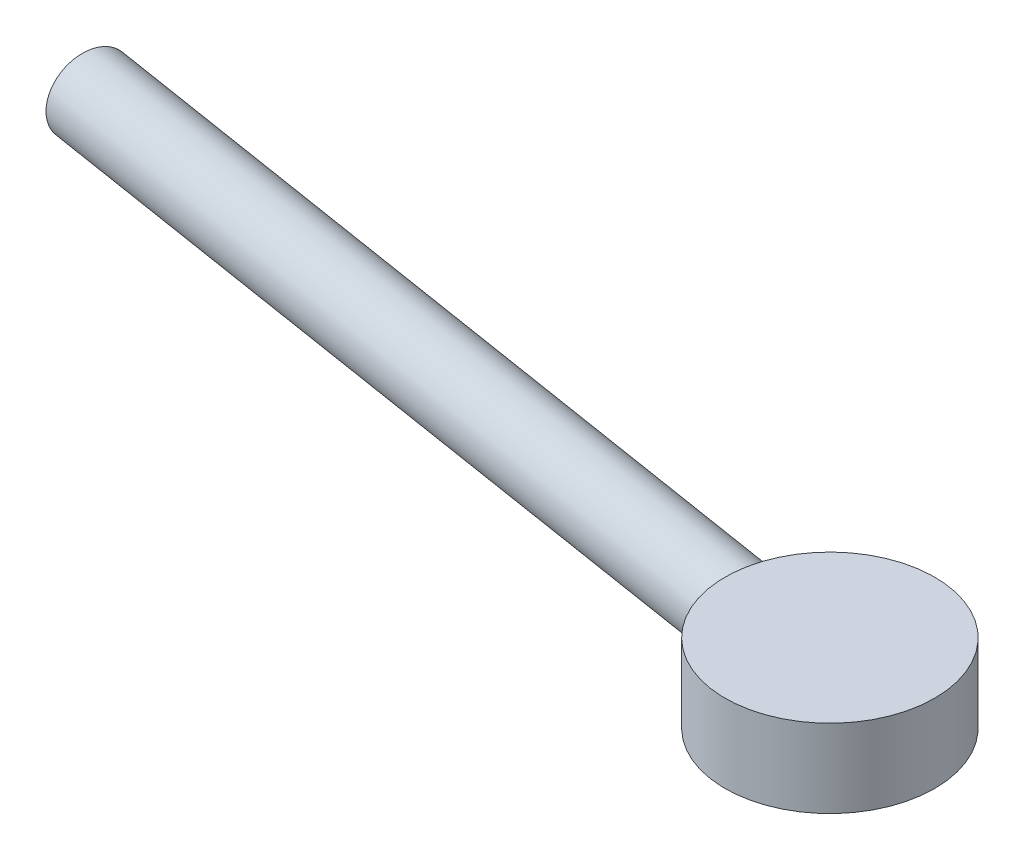
ISO-10303-21;
HEADER;
FILE_DESCRIPTION(('STEP AP214'),'2;1');
FILE_NAME('part.step','',(''),(''),'','','');
FILE_SCHEMA(('AUTOMOTIVE_DESIGN { 1 0 10303 214 1 1 1 1 }'));
ENDSEC;
DATA;
#1=APPLICATION_CONTEXT('core data for automotive mechanical design processes');
#2=APPLICATION_PROTOCOL_DEFINITION('international standard','automotive_design',2000,#1);
#3=PRODUCT_CONTEXT('',#1,'mechanical');
#4=PRODUCT('Part','Part','',(#3));
#5=PRODUCT_RELATED_PRODUCT_CATEGORY('part','',(#4));
#6=PRODUCT_DEFINITION_FORMATION('','',#4);
#7=PRODUCT_DEFINITION_CONTEXT('part definition',#1,'design');
#8=PRODUCT_DEFINITION('design','',#6,#7);
#9=PRODUCT_DEFINITION_SHAPE('','',#8);
#10=(LENGTH_UNIT() NAMED_UNIT(*) SI_UNIT(.MILLI.,.METRE.));
#11=(NAMED_UNIT(*) PLANE_ANGLE_UNIT() SI_UNIT($,.RADIAN.));
#12=(NAMED_UNIT(*) SI_UNIT($,.STERADIAN.) SOLID_ANGLE_UNIT());
#13=UNCERTAINTY_MEASURE_WITH_UNIT(LENGTH_MEASURE(1.E-05),#10,'distance_accuracy_value','');
#14=(GEOMETRIC_REPRESENTATION_CONTEXT(3) GLOBAL_UNCERTAINTY_ASSIGNED_CONTEXT((#13)) GLOBAL_UNIT_ASSIGNED_CONTEXT((#10,
#11,#12)) REPRESENTATION_CONTEXT('',''));
#15=CARTESIAN_POINT('',(0.,0.,0.));
#16=DIRECTION('',(0.,0.,1.));
#17=DIRECTION('',(1.,0.,0.));
#18=AXIS2_PLACEMENT_3D('',#15,#16,#17);
#19=CARTESIAN_POINT('',(271.72363231668,-177.5,758.099174894368));
#20=DIRECTION('',(0.,-1.,0.));
#21=DIRECTION('',(1.,0.,0.));
#22=AXIS2_PLACEMENT_3D('',#19,#20,#21);
#23=CYLINDRICAL_SURFACE('',#22,100.5);
#24=CARTESIAN_POINT('',(172.46982427228,-179.,742.321608900678));
#25=CARTESIAN_POINT('',(172.31631210881,-178.999997315081,743.287313929384));
#26=CARTESIAN_POINT('',(172.176934915852,-179.039870688081,744.255226601131));
#27=CARTESIAN_POINT('',(171.927194829372,-179.19895285225,746.188229031664));
#28=CARTESIAN_POINT('',(171.816830409184,-179.318157467804,747.153318936342));
#29=CARTESIAN_POINT('',(171.625096877349,-179.634717946961,749.073425182902));
#30=CARTESIAN_POINT('',(171.543726083843,-179.832069276039,750.028442105977));
#31=CARTESIAN_POINT('',(171.409192871476,-180.303058640155,751.921491941369));
#32=CARTESIAN_POINT('',(171.356030968829,-180.576698071108,752.859524542573));
#33=CARTESIAN_POINT('',(171.276525609291,-181.197231677718,754.710208248718));
#34=CARTESIAN_POINT('',(171.250132037521,-181.543987490745,755.622903660312));
#35=CARTESIAN_POINT('',(171.221925028493,-182.308176089655,757.41855790376));
#36=CARTESIAN_POINT('',(171.220111451549,-182.725608473871,758.301516904577));
#37=CARTESIAN_POINT('',(171.238495685095,-183.628046415343,760.03214508369));
#38=CARTESIAN_POINT('',(171.258697556974,-184.113064426327,760.879807720594));
#39=CARTESIAN_POINT('',(171.318130990364,-185.147184500078,762.534351560117));
#40=CARTESIAN_POINT('',(171.357363094487,-185.696288389794,763.341231599173));
#41=CARTESIAN_POINT('',(171.453230711861,-186.875658069705,764.937146397411));
#42=CARTESIAN_POINT('',(171.510433158378,-187.508108924389,765.724538198363));
#43=CARTESIAN_POINT('',(171.605903087485,-188.502223324553,766.864789395588));
#44=CARTESIAN_POINT('',(171.639339491561,-188.841187196011,767.23808595662));
#45=CARTESIAN_POINT('',(171.708934236078,-189.533887574503,767.970625178138));
#46=CARTESIAN_POINT('',(171.745093233737,-189.88762763919,768.329864413256));
#47=CARTESIAN_POINT('',(171.856872679971,-190.970173200054,769.385493183875));
#48=CARTESIAN_POINT('',(171.935799934545,-191.720348100585,770.059844302957));
#49=CARTESIAN_POINT('',(172.098209226895,-193.2730467989,771.344725792829));
#50=CARTESIAN_POINT('',(172.181691247272,-194.075570396697,771.955256407408));
#51=CARTESIAN_POINT('',(172.308561442199,-195.329138139195,772.829565525753));
#52=CARTESIAN_POINT('',(172.351851038787,-195.762847446274,773.118464323782));
#53=CARTESIAN_POINT('',(172.437922496907,-196.642215466614,773.677291087028));
#54=CARTESIAN_POINT('',(172.480704477207,-197.087871301861,773.947223565638));
#55=CARTESIAN_POINT('',(172.607454754822,-198.441976920719,774.727810462698));
#56=CARTESIAN_POINT('',(172.689834679751,-199.36763521868,775.209303489732));
#57=CARTESIAN_POINT('',(172.8459174594,-201.257839194196,776.089377097382));
#58=CARTESIAN_POINT('',(172.91962274925,-202.222373855879,776.487980970725));
#59=CARTESIAN_POINT('',(173.054459618276,-204.183833817146,777.198264008991));
#60=CARTESIAN_POINT('',(173.115591862501,-205.180757400296,777.509947771837));
#61=CARTESIAN_POINT('',(173.219942663182,-207.160932721956,778.032600535462));
#62=CARTESIAN_POINT('',(173.263754318327,-208.143261371265,778.246950419994));
#63=CARTESIAN_POINT('',(173.334440781677,-210.123465426699,778.589359749567));
#64=CARTESIAN_POINT('',(173.361315990622,-211.121340464402,778.717421236312));
#65=CARTESIAN_POINT('',(173.396731768693,-213.124483183985,778.885662164082));
#66=CARTESIAN_POINT('',(173.405278154783,-214.129748418797,778.925869487199));
#67=CARTESIAN_POINT('',(173.40360639912,-216.139898533814,778.917978016083));
#68=CARTESIAN_POINT('',(173.39338889884,-217.144783425845,778.869882240629));
#69=CARTESIAN_POINT('',(173.355772666558,-219.092106097862,778.690966260714));
#70=CARTESIAN_POINT('',(173.329330160243,-220.03498918714,778.564746907144));
#71=CARTESIAN_POINT('',(173.261364944105,-221.906582664612,778.235216560234));
#72=CARTESIAN_POINT('',(173.219842857373,-222.83529363675,778.03190875219));
#73=CARTESIAN_POINT('',(173.1236096973,-224.672427838032,777.55028625293));
#74=CARTESIAN_POINT('',(173.068897361894,-225.580849116733,777.271964383951));
#75=CARTESIAN_POINT('',(172.948750184362,-227.371546827156,776.643043486596));
#76=CARTESIAN_POINT('',(172.883315019035,-228.253822469866,776.292442279544));
#77=CARTESIAN_POINT('',(172.743375869885,-230.002496861909,775.515185063674));
#78=CARTESIAN_POINT('',(172.668731317377,-230.868334330543,775.087287531661));
#79=CARTESIAN_POINT('',(172.553252981936,-232.1387008791,774.394590182268));
#80=CARTESIAN_POINT('',(172.514172969596,-232.55744442844,774.155203032689));
#81=CARTESIAN_POINT('',(172.435274714456,-233.385070552599,773.659861739948));
#82=CARTESIAN_POINT('',(172.395456315818,-233.793951002895,773.403904070455));
#83=CARTESIAN_POINT('',(172.27557698255,-235.004888816677,772.611909833381));
#84=CARTESIAN_POINT('',(172.195088578829,-235.791278552082,772.051732429964));
#85=CARTESIAN_POINT('',(172.036714799602,-237.317752510704,770.871137878967));
#86=CARTESIAN_POINT('',(171.958829531222,-238.057834829343,770.250718256359));
#87=CARTESIAN_POINT('',(171.844486899156,-239.15200414056,769.258309660181));
#88=CARTESIAN_POINT('',(171.805742750429,-239.524224746425,768.906392708918));
#89=CARTESIAN_POINT('',(171.730599110932,-240.253876526776,768.187481874371));
#90=CARTESIAN_POINT('',(171.694199082307,-240.611311087118,767.820491481546));
#91=CARTESIAN_POINT('',(171.58931568877,-241.660811838135,766.697633395866));
#92=CARTESIAN_POINT('',(171.525144194334,-242.330120128007,765.919837927903));
#93=CARTESIAN_POINT('',(171.412572562628,-243.603387242922,764.311373665897));
#94=CARTESIAN_POINT('',(171.364174593008,-244.207337078573,763.48069762356));
#95=CARTESIAN_POINT('',(171.287129901791,-245.345702094789,761.772065014048));
#96=CARTESIAN_POINT('',(171.258483046338,-245.880117746573,760.894108767338));
#97=CARTESIAN_POINT('',(171.224345735117,-246.881861070195,759.085200838111));
#98=CARTESIAN_POINT('',(171.21916299948,-247.348220026073,758.153706265412));
#99=CARTESIAN_POINT('',(171.236067498901,-248.201445158735,756.255170337718));
#100=CARTESIAN_POINT('',(171.258155168355,-248.588310069126,755.28812841672));
#101=CARTESIAN_POINT('',(171.332238126327,-249.278832139014,753.326209490785));
#102=CARTESIAN_POINT('',(171.384223619152,-249.582516503611,752.331341704206));
#103=CARTESIAN_POINT('',(171.519985226683,-250.103786146196,750.321426685611));
#104=CARTESIAN_POINT('',(171.603759623828,-250.321376074584,749.306380546642));
#105=CARTESIAN_POINT('',(171.799173786819,-250.659625946029,747.314735713391));
#106=CARTESIAN_POINT('',(171.909240566616,-250.784526510688,746.338701143311));
#107=CARTESIAN_POINT('',(172.159082205757,-250.953164859677,744.383433416232));
#108=CARTESIAN_POINT('',(172.298856090117,-250.996905307213,743.404200365246));
#109=CARTESIAN_POINT('',(172.607331608658,-251.002777096139,741.45023821782));
#110=CARTESIAN_POINT('',(172.776028148218,-250.964922796585,740.475508359159));
#111=CARTESIAN_POINT('',(173.140803284524,-250.808022880749,738.537791213422));
#112=CARTESIAN_POINT('',(173.336881526487,-250.688978316368,737.574803774374));
#113=CARTESIAN_POINT('',(173.746892521225,-250.376393931794,735.700583839123));
#114=CARTESIAN_POINT('',(173.959976593286,-250.185564093089,734.788711674334));
#115=CARTESIAN_POINT('',(174.406801746236,-249.731075539023,732.988528385686));
#116=CARTESIAN_POINT('',(174.640542226146,-249.467418942012,732.10021657734));
#117=CARTESIAN_POINT('',(175.125511049204,-248.869504881894,730.352543928795));
#118=CARTESIAN_POINT('',(175.376740872738,-248.535241437381,729.49318554852));
#119=CARTESIAN_POINT('',(175.893071270581,-247.798791771942,727.808417687898));
#120=CARTESIAN_POINT('',(176.158172273513,-247.396603451259,726.983009258026));
#121=CARTESIAN_POINT('',(176.705952144549,-246.514983184817,725.347764682459));
#122=CARTESIAN_POINT('',(176.988916052897,-246.03368939097,724.539027965497));
#123=CARTESIAN_POINT('',(177.560812293583,-245.00588243762,722.966376153733));
#124=CARTESIAN_POINT('',(177.849744707436,-244.459368386885,722.202461671636));
#125=CARTESIAN_POINT('',(178.428918511108,-243.30455350697,720.723010156597));
#126=CARTESIAN_POINT('',(178.719160260384,-242.696234581781,720.007487395126));
#127=CARTESIAN_POINT('',(179.295979427613,-241.421651024205,718.628455015709));
#128=CARTESIAN_POINT('',(179.582556728153,-240.755384540412,717.964947060906));
#129=CARTESIAN_POINT('',(180.161987636036,-239.332047903141,716.659436765371));
#130=CARTESIAN_POINT('',(180.454372094127,-238.572039394875,716.020425806611));
#131=CARTESIAN_POINT('',(181.023670564584,-236.996659107367,714.806955532911));
#132=CARTESIAN_POINT('',(181.300583996304,-236.181285252739,714.232498639945));
#133=CARTESIAN_POINT('',(181.833096000436,-234.500055662621,713.151374876513));
#134=CARTESIAN_POINT('',(182.088692894754,-233.634195961853,712.64471334118));
#135=CARTESIAN_POINT('',(182.572809656132,-231.857420199585,711.702391074439));
#136=CARTESIAN_POINT('',(182.801329970433,-230.94650488265,711.266729170242));
#137=CARTESIAN_POINT('',(183.226120863067,-229.084288298654,710.468878375916));
#138=CARTESIAN_POINT('',(183.422349037682,-228.132935961823,710.106785947911));
#139=CARTESIAN_POINT('',(183.777195617342,-226.197534471492,709.459575335598));
#140=CARTESIAN_POINT('',(183.935813783326,-225.213485110204,709.174457640561));
#141=CARTESIAN_POINT('',(184.211094075018,-223.220463416643,708.683743101915));
#142=CARTESIAN_POINT('',(184.327775372787,-222.211502699003,708.478109917529));
#143=CARTESIAN_POINT('',(184.515971828951,-220.176238478692,708.148096675226));
#144=CARTESIAN_POINT('',(184.587489759411,-219.149936044403,708.023711630396));
#145=CARTESIAN_POINT('',(184.680452351117,-217.149386756844,707.862307632538));
#146=CARTESIAN_POINT('',(184.70460382227,-216.175643574165,707.820564548711));
#147=CARTESIAN_POINT('',(184.710449152997,-214.227670298286,707.810448070084));
#148=CARTESIAN_POINT('',(184.69214476075,-213.253440226787,707.842071654307));
#149=CARTESIAN_POINT('',(184.613566418414,-211.311905680812,707.978395308733));
#150=CARTESIAN_POINT('',(184.553295753096,-210.344600670285,708.083089659562));
#151=CARTESIAN_POINT('',(184.392358454229,-208.423969143037,708.364631264938));
#152=CARTESIAN_POINT('',(184.291691771845,-207.470642643216,708.54147860671));
#153=CARTESIAN_POINT('',(184.055559129317,-205.608761952378,708.960441470073));
#154=CARTESIAN_POINT('',(183.921044520871,-204.699685825957,709.200780426954));
#155=CARTESIAN_POINT('',(183.619174115611,-202.907023434328,709.746805001409));
#156=CARTESIAN_POINT('',(183.45181909916,-202.02343656401,710.052489066249));
#157=CARTESIAN_POINT('',(183.08789121045,-200.286843086586,710.727218816685));
#158=CARTESIAN_POINT('',(182.891313042258,-199.433842057213,711.096275988886));
#159=CARTESIAN_POINT('',(182.473034881021,-197.763377253999,711.895449700319));
#160=CARTESIAN_POINT('',(182.25133385837,-196.945914938536,712.325568742222));
#161=CARTESIAN_POINT('',(181.775731493396,-195.311720116932,713.267081960107));
#162=CARTESIAN_POINT('',(181.520785085123,-194.496982663958,713.7814242382));
#163=CARTESIAN_POINT('',(181.125161311609,-193.311486776329,714.599074446901));
#164=CARTESIAN_POINT('',(180.99107795512,-192.922401922812,714.879331385079));
#165=CARTESIAN_POINT('',(180.719108192369,-192.156803808652,715.454972939708));
#166=CARTESIAN_POINT('',(180.581220921559,-191.78029344963,715.750361008434));
#167=CARTESIAN_POINT('',(180.162852175437,-190.670496005915,716.658641290899));
#168=CARTESIAN_POINT('',(179.877652020397,-189.956907606991,717.29367368245));
#169=CARTESIAN_POINT('',(179.300016198446,-188.586678726669,718.619460547776));
#170=CARTESIAN_POINT('',(179.007580437908,-187.930038982685,719.310215742866));
#171=CARTESIAN_POINT('',(178.560418784097,-186.975872807132,720.402616721337));
#172=CARTESIAN_POINT('',(178.406398996427,-186.656181719891,720.785377690083));
#173=CARTESIAN_POINT('',(178.098561903069,-186.034138008339,721.564647306121));
#174=CARTESIAN_POINT('',(177.944744558435,-185.731781344481,721.961152715617));
#175=CARTESIAN_POINT('',(177.484590422999,-184.851364221321,723.170724487595));
#176=CARTESIAN_POINT('',(177.179527503092,-184.299905665815,724.003904705629));
#177=CARTESIAN_POINT('',(176.578606191177,-183.272589244573,725.718632912463));
#178=CARTESIAN_POINT('',(176.282747587503,-182.796729639305,726.600179787717));
#179=CARTESIAN_POINT('',(175.705479998572,-181.924527803896,728.406363907908));
#180=CARTESIAN_POINT('',(175.424070823817,-181.528184530737,729.331000587437));
#181=CARTESIAN_POINT('',(174.87882538838,-180.816378920786,731.223364919249));
#182=CARTESIAN_POINT('',(174.615116218484,-180.501463014255,732.191335024358));
#183=CARTESIAN_POINT('',(174.111738871705,-179.959117701764,734.157620511907));
#184=CARTESIAN_POINT('',(173.872071036046,-179.731689537403,735.155936324788));
#185=CARTESIAN_POINT('',(173.420596199331,-179.366850003601,737.174726953418));
#186=CARTESIAN_POINT('',(173.208779970249,-179.229408758575,738.19519429851));
#187=CARTESIAN_POINT('',(172.815818732228,-179.045988129664,740.250129429054));
#188=CARTESIAN_POINT('',(172.634671757978,-179.000002883173,741.284596312813));
#189=CARTESIAN_POINT('',(172.46982427228,-179.,742.321608900678));
#190=B_SPLINE_CURVE_WITH_KNOTS('',3,(#24,#25,#26,#27,#28,#29,#30,#31,#32,#33,#34,#35,#36,#37,
#38,#39,#40,#41,#42,#43,#44,#45,#46,#47,#48,#49,#50,#51,#52,#53,#54,#55,#56,#57,#58,#59,#60,#61,
#62,#63,#64,#65,#66,#67,#68,#69,#70,#71,#72,#73,#74,#75,#76,#77,#78,#79,#80,#81,#82,#83,#84,#85,
#86,#87,#88,#89,#90,#91,#92,#93,#94,#95,#96,#97,#98,#99,#100,#101,#102,#103,#104,#105,#106,#107,
#108,#109,#110,#111,#112,#113,#114,#115,#116,#117,#118,#119,#120,#121,#122,#123,#124,#125,#126,
#127,#128,#129,#130,#131,#132,#133,#134,#135,#136,#137,#138,#139,#140,#141,#142,#143,#144,#145,
#146,#147,#148,#149,#150,#151,#152,#153,#154,#155,#156,#157,#158,#159,#160,#161,#162,#163,#164,
#165,#166,#167,#168,#169,#170,#171,#172,#173,#174,#175,#176,#177,#178,#179,#180,#181,#182,#183,
#184,#185,#186,#187,#188,#189),.UNSPECIFIED.,.T.,.F.,(4,2,2,2,2,2,2,2,2,2,2,2,2,2,2,2,2,2,2,2,2,
2,2,2,2,2,2,2,2,2,2,2,2,2,2,2,2,2,2,2,2,2,2,2,2,2,2,2,2,2,2,2,2,2,2,2,2,2,2,2,2,2,2,2,2,2,2,2,2,
2,2,2,2,2,2,2,2,2,2,2,2,2,4),(0.,2.9325113103499,5.86486827963452,8.79705512150773,
11.7292956198267,14.6560362735807,17.5827602946943,20.5100243262371,23.4373718280684,
26.4683507711754,27.9840027174321,29.5000217135444,32.5318588386732,35.5636843820503,
37.1320008844992,38.699942903543,41.8355693001988,44.9703133584513,48.1048915627109,
51.1202013629031,54.1354398141557,57.1497211863822,60.1638995126324,63.0155355955071,
65.8670538614948,68.7188450735266,71.5707222580605,74.4733104751429,75.9247455357402,
77.3764904945711,80.2798576214673,83.1833440825982,84.724069896031,86.2644409231592,
89.3450005403576,92.4259833202254,95.5069452198231,98.6281975093466,101.749499518718,
104.869779450106,107.989890816249,110.956559910779,113.92313165469,116.889181383523,
119.855192684948,122.718941062706,125.582606149916,128.446513927694,131.310510253476,
134.255450572781,137.20043113915,140.146276472636,143.092215959487,146.19389821144,
149.295696795036,152.397739330242,155.499730619952,158.605763268639,161.711815659608,
164.816446261035,167.920886286021,170.842056899861,173.763107232478,176.68392895518,
179.604754208851,182.451207294037,185.297592749141,188.144494667414,190.991513301979,
193.977914842953,195.471286985322,196.965001382046,199.952298423133,202.939634140116,
204.505060112876,206.070119789433,209.199996675334,212.329801532315,215.459565332872,
218.609816578042,221.760112529024,224.909362053267,228.058409694617),.UNSPECIFIED.);
#191=CARTESIAN_POINT('',(172.46982427228,-179.,742.321608900678));
#192=VERTEX_POINT('',#191);
#193=EDGE_CURVE('E10',#192,#192,#190,.T.);
#194=ORIENTED_EDGE('',*,*,#193,.T.);
#195=EDGE_LOOP('',(#194));
#196=FACE_BOUND('',#195,.T.);
#197=CARTESIAN_POINT('',(271.72363231668,-177.5,758.099174894368));
#198=DIRECTION('',(0.,-1.,0.));
#199=DIRECTION('',(1.,0.,0.));
#200=AXIS2_PLACEMENT_3D('',#197,#198,#199);
#201=CIRCLE('',#200,100.5);
#202=CARTESIAN_POINT('',(372.22363231668,-177.500000000001,758.099174894368));
#203=VERTEX_POINT('',#202);
#204=EDGE_CURVE('E30',#203,#203,#201,.T.);
#205=ORIENTED_EDGE('',*,*,#204,.T.);
#206=EDGE_LOOP('',(#205));
#207=FACE_BOUND('',#206,.T.);
#208=CARTESIAN_POINT('',(271.72363231668,-252.5,758.099174894368));
#209=DIRECTION('',(0.,-1.,0.));
#210=DIRECTION('',(1.,0.,0.));
#211=AXIS2_PLACEMENT_3D('',#208,#209,#210);
#212=CIRCLE('',#211,100.5);
#213=CARTESIAN_POINT('',(372.22363231668,-252.500000000001,758.099174894368));
#214=VERTEX_POINT('',#213);
#215=EDGE_CURVE('E34',#214,#214,#212,.T.);
#216=ORIENTED_EDGE('',*,*,#215,.F.);
#217=EDGE_LOOP('',(#216));
#218=FACE_BOUND('',#217,.T.);
#219=ADVANCED_FACE('F15',(#196,#207,#218),#23,.T.);
#220=CARTESIAN_POINT('',(271.72363231668,-177.5,758.099174894368));
#221=DIRECTION('',(0.,-1.,0.));
#222=DIRECTION('',(1.,0.,0.));
#223=AXIS2_PLACEMENT_3D('',#220,#221,#222);
#224=PLANE('',#223);
#225=ORIENTED_EDGE('',*,*,#204,.F.);
#226=EDGE_LOOP('',(#225));
#227=FACE_BOUND('',#226,.T.);
#228=ADVANCED_FACE('F43',(#227),#224,.F.);
#229=CARTESIAN_POINT('',(271.72363231668,-252.5,758.099174894368));
#230=DIRECTION('',(0.,-1.,0.));
#231=DIRECTION('',(1.,0.,0.));
#232=AXIS2_PLACEMENT_3D('',#229,#230,#231);
#233=PLANE('',#232);
#234=ORIENTED_EDGE('',*,*,#215,.T.);
#235=EDGE_LOOP('',(#234));
#236=FACE_BOUND('',#235,.T.);
#237=ADVANCED_FACE('F40',(#236),#233,.T.);
#238=CARTESIAN_POINT('',(-673.13645088546,-214.999999999993,607.902496185005));
#239=DIRECTION('',(0.987600080043788,0.,0.156990706404881));
#240=DIRECTION('',(0.,1.,0.));
#241=AXIS2_PLACEMENT_3D('',#238,#239,#240);
#242=CYLINDRICAL_SURFACE('',#241,36.);
#243=ORIENTED_EDGE('',*,*,#193,.F.);
#244=EDGE_LOOP('',(#243));
#245=FACE_BOUND('',#244,.T.);
#246=CARTESIAN_POINT('',(-572.575676112755,-214.999999999994,623.887819988835));
#247=DIRECTION('',(0.987600080043788,0.,0.156990706404881));
#248=DIRECTION('',(-0.156990706404881,0.,0.987600080043788));
#249=AXIS2_PLACEMENT_3D('',#246,#247,#248);
#250=CIRCLE('',#249,36.);
#251=CARTESIAN_POINT('',(-578.227341543331,-214.999999999994,659.441422870411));
#252=VERTEX_POINT('',#251);
#253=EDGE_CURVE('E26',#252,#252,#250,.F.);
#254=ORIENTED_EDGE('',*,*,#253,.F.);
#255=EDGE_LOOP('',(#254));
#256=FACE_BOUND('',#255,.T.);
#257=ADVANCED_FACE('F17',(#245,#256),#242,.T.);
#258=CARTESIAN_POINT('',(-572.575676112755,-214.999999999994,623.887819988835));
#259=DIRECTION('',(0.987600080043788,0.,0.156990706404881));
#260=DIRECTION('',(0.,1.,0.));
#261=AXIS2_PLACEMENT_3D('',#258,#259,#260);
#262=PLANE('',#261);
#263=ORIENTED_EDGE('',*,*,#253,.T.);
#264=EDGE_LOOP('',(#263));
#265=FACE_BOUND('',#264,.T.);
#266=ADVANCED_FACE('F53',(#265),#262,.F.);
#267=CLOSED_SHELL('',(#219,#228,#237,#257,#266));
#268=MANIFOLD_SOLID_BREP('B1',#267);
#269=ADVANCED_BREP_SHAPE_REPRESENTATION('',(#18,#268),#14);
#270=SHAPE_DEFINITION_REPRESENTATION(#9,#269);
ENDSEC;
END-ISO-10303-21;
